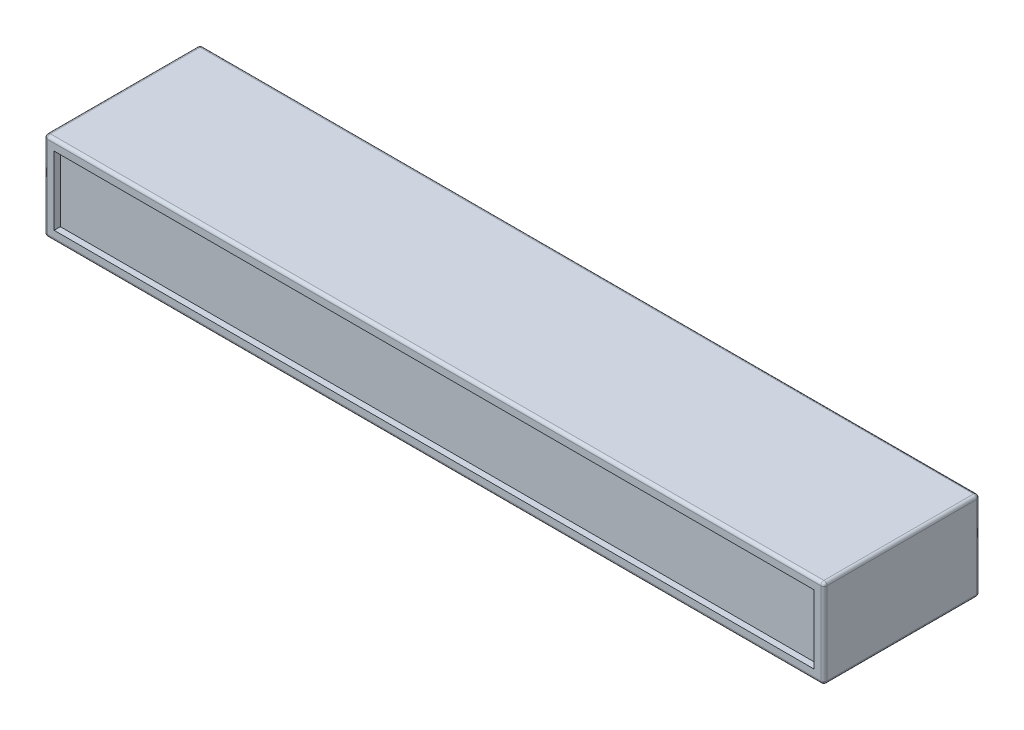
ISO-10303-21;
HEADER;
FILE_DESCRIPTION(('STEP AP214'),'2;1');
FILE_NAME('part.step','',(''),(''),'','','');
FILE_SCHEMA(('AUTOMOTIVE_DESIGN { 1 0 10303 214 1 1 1 1 }'));
ENDSEC;
DATA;
#1=APPLICATION_CONTEXT('core data for automotive mechanical design processes');
#2=APPLICATION_PROTOCOL_DEFINITION('international standard','automotive_design',2000,#1);
#3=PRODUCT_CONTEXT('',#1,'mechanical');
#4=PRODUCT('Part','Part','',(#3));
#5=PRODUCT_RELATED_PRODUCT_CATEGORY('part','',(#4));
#6=PRODUCT_DEFINITION_FORMATION('','',#4);
#7=PRODUCT_DEFINITION_CONTEXT('part definition',#1,'design');
#8=PRODUCT_DEFINITION('design','',#6,#7);
#9=PRODUCT_DEFINITION_SHAPE('','',#8);
#10=(LENGTH_UNIT() NAMED_UNIT(*) SI_UNIT(.MILLI.,.METRE.));
#11=(NAMED_UNIT(*) PLANE_ANGLE_UNIT() SI_UNIT($,.RADIAN.));
#12=(NAMED_UNIT(*) SI_UNIT($,.STERADIAN.) SOLID_ANGLE_UNIT());
#13=UNCERTAINTY_MEASURE_WITH_UNIT(LENGTH_MEASURE(1.E-05),#10,'distance_accuracy_value','');
#14=(GEOMETRIC_REPRESENTATION_CONTEXT(3) GLOBAL_UNCERTAINTY_ASSIGNED_CONTEXT((#13)) GLOBAL_UNIT_ASSIGNED_CONTEXT((#10,
#11,#12)) REPRESENTATION_CONTEXT('',''));
#15=CARTESIAN_POINT('',(0.,0.,0.));
#16=DIRECTION('',(0.,0.,1.));
#17=DIRECTION('',(1.,0.,0.));
#18=AXIS2_PLACEMENT_3D('',#15,#16,#17);
#19=CARTESIAN_POINT('',(0.,0.,500.));
#20=DIRECTION('',(1.,0.,0.));
#21=DIRECTION('',(0.,0.,-1.));
#22=AXIS2_PLACEMENT_3D('',#19,#20,#21);
#23=PLANE('',#22);
#24=DIRECTION('',(0.,0.,-1.));
#25=VECTOR('',#24,1.);
#26=CARTESIAN_POINT('',(0.,274.,500.));
#27=LINE('',#26,#25);
#28=CARTESIAN_POINT('',(0.,274.,490.));
#29=VERTEX_POINT('',#28);
#30=CARTESIAN_POINT('',(0.,274.,10.));
#31=VERTEX_POINT('',#30);
#32=EDGE_CURVE('E263',#29,#31,#27,.T.);
#33=ORIENTED_EDGE('',*,*,#32,.T.);
#34=DIRECTION('',(0.,-1.,0.));
#35=VECTOR('',#34,1.);
#36=CARTESIAN_POINT('',(0.,0.,10.));
#37=LINE('',#36,#35);
#38=CARTESIAN_POINT('',(0.,10.,10.));
#39=VERTEX_POINT('',#38);
#40=EDGE_CURVE('E267',#31,#39,#37,.T.);
#41=ORIENTED_EDGE('',*,*,#40,.T.);
#42=DIRECTION('',(0.,0.,-1.));
#43=VECTOR('',#42,1.);
#44=CARTESIAN_POINT('',(0.,10.,500.));
#45=LINE('',#44,#43);
#46=CARTESIAN_POINT('',(0.,10.,490.));
#47=VERTEX_POINT('',#46);
#48=EDGE_CURVE('E260',#39,#47,#45,.F.);
#49=ORIENTED_EDGE('',*,*,#48,.T.);
#50=DIRECTION('',(0.,-1.,0.));
#51=VECTOR('',#50,1.);
#52=CARTESIAN_POINT('',(0.,0.,490.));
#53=LINE('',#52,#51);
#54=EDGE_CURVE('E257',#47,#29,#53,.F.);
#55=ORIENTED_EDGE('',*,*,#54,.T.);
#56=EDGE_LOOP('',(#33,#41,#49,#55));
#57=FACE_BOUND('',#56,.T.);
#58=ADVANCED_FACE('F39',(#57),#23,.F.);
#59=CARTESIAN_POINT('',(0.,0.,500.));
#60=DIRECTION('',(0.,1.,0.));
#61=DIRECTION('',(0.,0.,1.));
#62=AXIS2_PLACEMENT_3D('',#59,#60,#61);
#63=PLANE('',#62);
#64=DIRECTION('',(1.,0.,0.));
#65=VECTOR('',#64,1.);
#66=CARTESIAN_POINT('',(2500.,0.,10.));
#67=LINE('',#66,#65);
#68=CARTESIAN_POINT('',(10.,0.,10.));
#69=VERTEX_POINT('',#68);
#70=CARTESIAN_POINT('',(2490.,0.,10.));
#71=VERTEX_POINT('',#70);
#72=EDGE_CURVE('E237',#69,#71,#67,.T.);
#73=ORIENTED_EDGE('',*,*,#72,.T.);
#74=DIRECTION('',(0.,0.,-1.));
#75=VECTOR('',#74,1.);
#76=CARTESIAN_POINT('',(2490.,0.,500.));
#77=LINE('',#76,#75);
#78=CARTESIAN_POINT('',(2490.,0.,490.));
#79=VERTEX_POINT('',#78);
#80=EDGE_CURVE('E240',#71,#79,#77,.F.);
#81=ORIENTED_EDGE('',*,*,#80,.T.);
#82=DIRECTION('',(1.,0.,0.));
#83=VECTOR('',#82,1.);
#84=CARTESIAN_POINT('',(0.,0.,490.));
#85=LINE('',#84,#83);
#86=CARTESIAN_POINT('',(10.,0.,490.));
#87=VERTEX_POINT('',#86);
#88=EDGE_CURVE('E231',#79,#87,#85,.F.);
#89=ORIENTED_EDGE('',*,*,#88,.T.);
#90=DIRECTION('',(0.,0.,-1.));
#91=VECTOR('',#90,1.);
#92=CARTESIAN_POINT('',(10.,0.,500.));
#93=LINE('',#92,#91);
#94=EDGE_CURVE('E234',#87,#69,#93,.T.);
#95=ORIENTED_EDGE('',*,*,#94,.T.);
#96=EDGE_LOOP('',(#73,#81,#89,#95));
#97=FACE_BOUND('',#96,.T.);
#98=ADVANCED_FACE('F384',(#97),#63,.F.);
#99=CARTESIAN_POINT('',(2500.,0.,500.));
#100=DIRECTION('',(-1.,0.,0.));
#101=DIRECTION('',(0.,0.,1.));
#102=AXIS2_PLACEMENT_3D('',#99,#100,#101);
#103=PLANE('',#102);
#104=DIRECTION('',(0.,0.,-1.));
#105=VECTOR('',#104,1.);
#106=CARTESIAN_POINT('',(2500.,10.,500.));
#107=LINE('',#106,#105);
#108=CARTESIAN_POINT('',(2500.,10.,490.));
#109=VERTEX_POINT('',#108);
#110=CARTESIAN_POINT('',(2500.,10.,10.));
#111=VERTEX_POINT('',#110);
#112=EDGE_CURVE('E211',#109,#111,#107,.T.);
#113=ORIENTED_EDGE('',*,*,#112,.T.);
#114=DIRECTION('',(0.,1.,0.));
#115=VECTOR('',#114,1.);
#116=CARTESIAN_POINT('',(2500.,284.,10.));
#117=LINE('',#116,#115);
#118=CARTESIAN_POINT('',(2500.,274.,10.));
#119=VERTEX_POINT('',#118);
#120=EDGE_CURVE('E214',#111,#119,#117,.T.);
#121=ORIENTED_EDGE('',*,*,#120,.T.);
#122=DIRECTION('',(0.,0.,-1.));
#123=VECTOR('',#122,1.);
#124=CARTESIAN_POINT('',(2500.,274.,500.));
#125=LINE('',#124,#123);
#126=CARTESIAN_POINT('',(2500.,274.,490.));
#127=VERTEX_POINT('',#126);
#128=EDGE_CURVE('E208',#119,#127,#125,.F.);
#129=ORIENTED_EDGE('',*,*,#128,.T.);
#130=DIRECTION('',(0.,1.,0.));
#131=VECTOR('',#130,1.);
#132=CARTESIAN_POINT('',(2500.,0.,490.));
#133=LINE('',#132,#131);
#134=EDGE_CURVE('E205',#127,#109,#133,.F.);
#135=ORIENTED_EDGE('',*,*,#134,.T.);
#136=EDGE_LOOP('',(#113,#121,#129,#135));
#137=FACE_BOUND('',#136,.T.);
#138=ADVANCED_FACE('F427',(#137),#103,.F.);
#139=CARTESIAN_POINT('',(0.,284.,500.));
#140=DIRECTION('',(0.,-1.,0.));
#141=DIRECTION('',(0.,0.,-1.));
#142=AXIS2_PLACEMENT_3D('',#139,#140,#141);
#143=PLANE('',#142);
#144=DIRECTION('',(-1.,0.,0.));
#145=VECTOR('',#144,1.);
#146=CARTESIAN_POINT('',(0.,284.,490.));
#147=LINE('',#146,#145);
#148=CARTESIAN_POINT('',(10.,284.,490.));
#149=VERTEX_POINT('',#148);
#150=CARTESIAN_POINT('',(2490.,284.,490.));
#151=VERTEX_POINT('',#150);
#152=EDGE_CURVE('E244',#149,#151,#147,.F.);
#153=ORIENTED_EDGE('',*,*,#152,.T.);
#154=DIRECTION('',(0.,0.,-1.));
#155=VECTOR('',#154,1.);
#156=CARTESIAN_POINT('',(2490.,284.,500.));
#157=LINE('',#156,#155);
#158=CARTESIAN_POINT('',(2490.,284.,10.));
#159=VERTEX_POINT('',#158);
#160=EDGE_CURVE('E253',#151,#159,#157,.T.);
#161=ORIENTED_EDGE('',*,*,#160,.T.);
#162=DIRECTION('',(-1.,0.,0.));
#163=VECTOR('',#162,1.);
#164=CARTESIAN_POINT('',(0.,284.,10.));
#165=LINE('',#164,#163);
#166=CARTESIAN_POINT('',(10.,284.,10.));
#167=VERTEX_POINT('',#166);
#168=EDGE_CURVE('E250',#159,#167,#165,.T.);
#169=ORIENTED_EDGE('',*,*,#168,.T.);
#170=DIRECTION('',(0.,0.,-1.));
#171=VECTOR('',#170,1.);
#172=CARTESIAN_POINT('',(10.,284.,500.));
#173=LINE('',#172,#171);
#174=EDGE_CURVE('E247',#167,#149,#173,.F.);
#175=ORIENTED_EDGE('',*,*,#174,.T.);
#176=EDGE_LOOP('',(#153,#161,#169,#175));
#177=FACE_BOUND('',#176,.T.);
#178=ADVANCED_FACE('F662',(#177),#143,.F.);
#179=CARTESIAN_POINT('',(0.,0.,500.));
#180=DIRECTION('',(0.,0.,-1.));
#181=DIRECTION('',(-1.,0.,0.));
#182=AXIS2_PLACEMENT_3D('',#179,#180,#181);
#183=PLANE('',#182);
#184=DIRECTION('',(-1.,0.,0.));
#185=VECTOR('',#184,1.);
#186=CARTESIAN_POINT('',(2468.,252.,500.));
#187=LINE('',#186,#185);
#188=CARTESIAN_POINT('',(2468.,252.,500.));
#189=VERTEX_POINT('',#188);
#190=CARTESIAN_POINT('',(32.,252.,500.));
#191=VERTEX_POINT('',#190);
#192=EDGE_CURVE('E190',#189,#191,#187,.T.);
#193=ORIENTED_EDGE('',*,*,#192,.F.);
#194=DIRECTION('',(0.,1.,0.));
#195=VECTOR('',#194,1.);
#196=CARTESIAN_POINT('',(2468.,252.,500.));
#197=LINE('',#196,#195);
#198=CARTESIAN_POINT('',(2468.,32.,500.));
#199=VERTEX_POINT('',#198);
#200=EDGE_CURVE('E57',#199,#189,#197,.T.);
#201=ORIENTED_EDGE('',*,*,#200,.F.);
#202=DIRECTION('',(1.,0.,0.));
#203=VECTOR('',#202,1.);
#204=CARTESIAN_POINT('',(2468.,32.,500.));
#205=LINE('',#204,#203);
#206=CARTESIAN_POINT('',(32.,31.9999999999997,500.));
#207=VERTEX_POINT('',#206);
#208=EDGE_CURVE('E177',#207,#199,#205,.T.);
#209=ORIENTED_EDGE('',*,*,#208,.F.);
#210=DIRECTION('',(0.,-1.,0.));
#211=VECTOR('',#210,1.);
#212=CARTESIAN_POINT('',(32.,252.,500.));
#213=LINE('',#212,#211);
#214=EDGE_CURVE('E181',#191,#207,#213,.T.);
#215=ORIENTED_EDGE('',*,*,#214,.F.);
#216=EDGE_LOOP('',(#193,#201,#209,#215));
#217=FACE_BOUND('',#216,.T.);
#218=DIRECTION('',(0.,1.,0.));
#219=VECTOR('',#218,1.);
#220=CARTESIAN_POINT('',(2490.,0.,500.));
#221=LINE('',#220,#219);
#222=CARTESIAN_POINT('',(2490.,10.,500.));
#223=VERTEX_POINT('',#222);
#224=CARTESIAN_POINT('',(2490.,274.,500.));
#225=VERTEX_POINT('',#224);
#226=EDGE_CURVE('E49',#223,#225,#221,.T.);
#227=ORIENTED_EDGE('',*,*,#226,.T.);
#228=DIRECTION('',(-1.,0.,0.));
#229=VECTOR('',#228,1.);
#230=CARTESIAN_POINT('',(0.,274.,500.));
#231=LINE('',#230,#229);
#232=CARTESIAN_POINT('',(10.,274.,500.));
#233=VERTEX_POINT('',#232);
#234=EDGE_CURVE('E11',#225,#233,#231,.T.);
#235=ORIENTED_EDGE('',*,*,#234,.T.);
#236=DIRECTION('',(0.,-1.,0.));
#237=VECTOR('',#236,1.);
#238=CARTESIAN_POINT('',(10.,0.,500.));
#239=LINE('',#238,#237);
#240=CARTESIAN_POINT('',(10.,10.,500.));
#241=VERTEX_POINT('',#240);
#242=EDGE_CURVE('E270',#233,#241,#239,.T.);
#243=ORIENTED_EDGE('',*,*,#242,.T.);
#244=DIRECTION('',(1.,0.,0.));
#245=VECTOR('',#244,1.);
#246=CARTESIAN_POINT('',(0.,10.,500.));
#247=LINE('',#246,#245);
#248=EDGE_CURVE('E273',#241,#223,#247,.T.);
#249=ORIENTED_EDGE('',*,*,#248,.T.);
#250=EDGE_LOOP('',(#227,#235,#243,#249));
#251=FACE_BOUND('',#250,.T.);
#252=ADVANCED_FACE('F391',(#217,#251),#183,.F.);
#253=CARTESIAN_POINT('',(0.,0.,0.));
#254=DIRECTION('',(0.,0.,-1.));
#255=DIRECTION('',(-1.,0.,0.));
#256=AXIS2_PLACEMENT_3D('',#253,#254,#255);
#257=PLANE('',#256);
#258=DIRECTION('',(-1.,0.,0.));
#259=VECTOR('',#258,1.);
#260=CARTESIAN_POINT('',(2500.,274.,0.));
#261=LINE('',#260,#259);
#262=CARTESIAN_POINT('',(10.,274.,0.));
#263=VERTEX_POINT('',#262);
#264=CARTESIAN_POINT('',(2490.,274.,0.));
#265=VERTEX_POINT('',#264);
#266=EDGE_CURVE('E221',#263,#265,#261,.F.);
#267=ORIENTED_EDGE('',*,*,#266,.T.);
#268=DIRECTION('',(0.,1.,0.));
#269=VECTOR('',#268,1.);
#270=CARTESIAN_POINT('',(2490.,0.,0.));
#271=LINE('',#270,#269);
#272=CARTESIAN_POINT('',(2490.,10.,0.));
#273=VERTEX_POINT('',#272);
#274=EDGE_CURVE('E227',#265,#273,#271,.F.);
#275=ORIENTED_EDGE('',*,*,#274,.T.);
#276=DIRECTION('',(1.,0.,0.));
#277=VECTOR('',#276,1.);
#278=CARTESIAN_POINT('',(0.,10.,0.));
#279=LINE('',#278,#277);
#280=CARTESIAN_POINT('',(10.,10.,0.));
#281=VERTEX_POINT('',#280);
#282=EDGE_CURVE('E224',#273,#281,#279,.F.);
#283=ORIENTED_EDGE('',*,*,#282,.T.);
#284=DIRECTION('',(0.,-1.,0.));
#285=VECTOR('',#284,1.);
#286=CARTESIAN_POINT('',(10.,284.,0.));
#287=LINE('',#286,#285);
#288=EDGE_CURVE('E218',#281,#263,#287,.F.);
#289=ORIENTED_EDGE('',*,*,#288,.T.);
#290=EDGE_LOOP('',(#267,#275,#283,#289));
#291=FACE_BOUND('',#290,.T.);
#292=ADVANCED_FACE('F415',(#291),#257,.T.);
#293=CARTESIAN_POINT('',(10.,0.,490.));
#294=DIRECTION('',(0.,-1.,0.));
#295=DIRECTION('',(0.,0.,-1.));
#296=AXIS2_PLACEMENT_3D('',#293,#294,#295);
#297=CYLINDRICAL_SURFACE('',#296,10.);
#298=CARTESIAN_POINT('',(10.,10.,490.));
#299=DIRECTION('',(0.,-1.,0.));
#300=DIRECTION('',(0.,0.,-1.));
#301=AXIS2_PLACEMENT_3D('',#298,#299,#300);
#302=CIRCLE('',#301,10.);
#303=EDGE_CURVE('E43',#241,#47,#302,.T.);
#304=ORIENTED_EDGE('',*,*,#303,.F.);
#305=ORIENTED_EDGE('',*,*,#242,.F.);
#306=CARTESIAN_POINT('',(10.,274.,490.));
#307=DIRECTION('',(0.,1.,0.));
#308=DIRECTION('',(0.,0.,1.));
#309=AXIS2_PLACEMENT_3D('',#306,#307,#308);
#310=CIRCLE('',#309,10.);
#311=EDGE_CURVE('E358',#29,#233,#310,.T.);
#312=ORIENTED_EDGE('',*,*,#311,.F.);
#313=ORIENTED_EDGE('',*,*,#54,.F.);
#314=EDGE_LOOP('',(#304,#305,#312,#313));
#315=FACE_BOUND('',#314,.T.);
#316=ADVANCED_FACE('F41',(#315),#297,.T.);
#317=CARTESIAN_POINT('',(10.,10.,490.));
#318=DIRECTION('',(0.,0.,1.));
#319=DIRECTION('',(1.,0.,0.));
#320=AXIS2_PLACEMENT_3D('',#317,#318,#319);
#321=SPHERICAL_SURFACE('',#320,10.);
#322=CARTESIAN_POINT('',(10.,10.,490.));
#323=DIRECTION('',(-1.,0.,0.));
#324=DIRECTION('',(0.,0.,1.));
#325=AXIS2_PLACEMENT_3D('',#322,#323,#324);
#326=CIRCLE('',#325,10.);
#327=EDGE_CURVE('E351',#241,#87,#326,.F.);
#328=ORIENTED_EDGE('',*,*,#327,.F.);
#329=ORIENTED_EDGE('',*,*,#303,.T.);
#330=CARTESIAN_POINT('',(10.,10.,490.));
#331=DIRECTION('',(0.,0.,1.));
#332=DIRECTION('',(1.,0.,0.));
#333=AXIS2_PLACEMENT_3D('',#330,#331,#332);
#334=CIRCLE('',#333,10.);
#335=EDGE_CURVE('E355',#87,#47,#334,.F.);
#336=ORIENTED_EDGE('',*,*,#335,.F.);
#337=EDGE_LOOP('',(#328,#329,#336));
#338=FACE_BOUND('',#337,.T.);
#339=ADVANCED_FACE('F372',(#338),#321,.T.);
#340=CARTESIAN_POINT('',(10.,274.,490.));
#341=DIRECTION('',(0.,0.,1.));
#342=DIRECTION('',(1.,0.,0.));
#343=AXIS2_PLACEMENT_3D('',#340,#341,#342);
#344=SPHERICAL_SURFACE('',#343,10.);
#345=CARTESIAN_POINT('',(10.,274.,490.));
#346=DIRECTION('',(0.,0.,1.));
#347=DIRECTION('',(1.,0.,0.));
#348=AXIS2_PLACEMENT_3D('',#345,#346,#347);
#349=CIRCLE('',#348,10.);
#350=EDGE_CURVE('E344',#29,#149,#349,.F.);
#351=ORIENTED_EDGE('',*,*,#350,.F.);
#352=ORIENTED_EDGE('',*,*,#311,.T.);
#353=CARTESIAN_POINT('',(10.,274.,490.));
#354=DIRECTION('',(-1.,0.,0.));
#355=DIRECTION('',(0.,0.,1.));
#356=AXIS2_PLACEMENT_3D('',#353,#354,#355);
#357=CIRCLE('',#356,10.);
#358=EDGE_CURVE('E348',#149,#233,#357,.F.);
#359=ORIENTED_EDGE('',*,*,#358,.F.);
#360=EDGE_LOOP('',(#351,#352,#359));
#361=FACE_BOUND('',#360,.T.);
#362=ADVANCED_FACE('F406',(#361),#344,.T.);
#363=CARTESIAN_POINT('',(10.,10.,500.));
#364=DIRECTION('',(0.,0.,-1.));
#365=DIRECTION('',(-1.,0.,0.));
#366=AXIS2_PLACEMENT_3D('',#363,#364,#365);
#367=CYLINDRICAL_SURFACE('',#366,10.);
#368=ORIENTED_EDGE('',*,*,#335,.T.);
#369=ORIENTED_EDGE('',*,*,#48,.F.);
#370=CARTESIAN_POINT('',(10.,10.,10.));
#371=DIRECTION('',(0.,0.,-1.));
#372=DIRECTION('',(-1.,0.,0.));
#373=AXIS2_PLACEMENT_3D('',#370,#371,#372);
#374=CIRCLE('',#373,10.);
#375=EDGE_CURVE('E336',#69,#39,#374,.T.);
#376=ORIENTED_EDGE('',*,*,#375,.F.);
#377=ORIENTED_EDGE('',*,*,#94,.F.);
#378=EDGE_LOOP('',(#368,#369,#376,#377));
#379=FACE_BOUND('',#378,.T.);
#380=ADVANCED_FACE('F379',(#379),#367,.T.);
#381=CARTESIAN_POINT('',(0.,10.,490.));
#382=DIRECTION('',(1.,0.,0.));
#383=DIRECTION('',(0.,0.,-1.));
#384=AXIS2_PLACEMENT_3D('',#381,#382,#383);
#385=CYLINDRICAL_SURFACE('',#384,10.);
#386=ORIENTED_EDGE('',*,*,#327,.T.);
#387=ORIENTED_EDGE('',*,*,#88,.F.);
#388=CARTESIAN_POINT('',(2490.,10.,490.));
#389=DIRECTION('',(1.,0.,0.));
#390=DIRECTION('',(0.,0.,-1.));
#391=AXIS2_PLACEMENT_3D('',#388,#389,#390);
#392=CIRCLE('',#391,10.);
#393=EDGE_CURVE('E332',#223,#79,#392,.T.);
#394=ORIENTED_EDGE('',*,*,#393,.F.);
#395=ORIENTED_EDGE('',*,*,#248,.F.);
#396=EDGE_LOOP('',(#386,#387,#394,#395));
#397=FACE_BOUND('',#396,.T.);
#398=ADVANCED_FACE('F390',(#397),#385,.T.);
#399=CARTESIAN_POINT('',(2490.,0.,490.));
#400=DIRECTION('',(0.,1.,0.));
#401=DIRECTION('',(0.,0.,1.));
#402=AXIS2_PLACEMENT_3D('',#399,#400,#401);
#403=CYLINDRICAL_SURFACE('',#402,10.);
#404=CARTESIAN_POINT('',(2490.,274.,490.));
#405=DIRECTION('',(0.,1.,0.));
#406=DIRECTION('',(0.,0.,1.));
#407=AXIS2_PLACEMENT_3D('',#404,#405,#406);
#408=CIRCLE('',#407,10.);
#409=EDGE_CURVE('E324',#225,#127,#408,.T.);
#410=ORIENTED_EDGE('',*,*,#409,.F.);
#411=ORIENTED_EDGE('',*,*,#226,.F.);
#412=CARTESIAN_POINT('',(2490.,10.,490.));
#413=DIRECTION('',(0.,-1.,0.));
#414=DIRECTION('',(0.,0.,-1.));
#415=AXIS2_PLACEMENT_3D('',#412,#413,#414);
#416=CIRCLE('',#415,10.);
#417=EDGE_CURVE('E328',#109,#223,#416,.T.);
#418=ORIENTED_EDGE('',*,*,#417,.F.);
#419=ORIENTED_EDGE('',*,*,#134,.F.);
#420=EDGE_LOOP('',(#410,#411,#418,#419));
#421=FACE_BOUND('',#420,.T.);
#422=ADVANCED_FACE('F395',(#421),#403,.T.);
#423=CARTESIAN_POINT('',(0.,274.,490.));
#424=DIRECTION('',(-1.,0.,0.));
#425=DIRECTION('',(0.,0.,1.));
#426=AXIS2_PLACEMENT_3D('',#423,#424,#425);
#427=CYLINDRICAL_SURFACE('',#426,10.);
#428=ORIENTED_EDGE('',*,*,#358,.T.);
#429=ORIENTED_EDGE('',*,*,#234,.F.);
#430=CARTESIAN_POINT('',(2490.,274.,490.));
#431=DIRECTION('',(1.,0.,0.));
#432=DIRECTION('',(0.,0.,-1.));
#433=AXIS2_PLACEMENT_3D('',#430,#431,#432);
#434=CIRCLE('',#433,10.);
#435=EDGE_CURVE('E320',#151,#225,#434,.T.);
#436=ORIENTED_EDGE('',*,*,#435,.F.);
#437=ORIENTED_EDGE('',*,*,#152,.F.);
#438=EDGE_LOOP('',(#428,#429,#436,#437));
#439=FACE_BOUND('',#438,.T.);
#440=ADVANCED_FACE('F405',(#439),#427,.T.);
#441=CARTESIAN_POINT('',(10.,274.,500.));
#442=DIRECTION('',(0.,0.,-1.));
#443=DIRECTION('',(-1.,0.,0.));
#444=AXIS2_PLACEMENT_3D('',#441,#442,#443);
#445=CYLINDRICAL_SURFACE('',#444,10.);
#446=ORIENTED_EDGE('',*,*,#350,.T.);
#447=ORIENTED_EDGE('',*,*,#174,.F.);
#448=CARTESIAN_POINT('',(10.,274.,10.));
#449=DIRECTION('',(0.,0.,-1.));
#450=DIRECTION('',(-1.,0.,0.));
#451=AXIS2_PLACEMENT_3D('',#448,#449,#450);
#452=CIRCLE('',#451,10.);
#453=EDGE_CURVE('E316',#31,#167,#452,.T.);
#454=ORIENTED_EDGE('',*,*,#453,.F.);
#455=ORIENTED_EDGE('',*,*,#32,.F.);
#456=EDGE_LOOP('',(#446,#447,#454,#455));
#457=FACE_BOUND('',#456,.T.);
#458=ADVANCED_FACE('F411',(#457),#445,.T.);
#459=CARTESIAN_POINT('',(10.,0.,10.));
#460=DIRECTION('',(0.,1.,0.));
#461=DIRECTION('',(0.,0.,1.));
#462=AXIS2_PLACEMENT_3D('',#459,#460,#461);
#463=CYLINDRICAL_SURFACE('',#462,10.);
#464=CARTESIAN_POINT('',(10.,10.,10.));
#465=DIRECTION('',(0.,-1.,0.));
#466=DIRECTION('',(0.,0.,-1.));
#467=AXIS2_PLACEMENT_3D('',#464,#465,#466);
#468=CIRCLE('',#467,10.);
#469=EDGE_CURVE('E340',#39,#281,#468,.T.);
#470=ORIENTED_EDGE('',*,*,#469,.F.);
#471=ORIENTED_EDGE('',*,*,#40,.F.);
#472=CARTESIAN_POINT('',(10.,274.,10.));
#473=DIRECTION('',(0.,1.,0.));
#474=DIRECTION('',(0.,0.,1.));
#475=AXIS2_PLACEMENT_3D('',#472,#473,#474);
#476=CIRCLE('',#475,10.);
#477=EDGE_CURVE('E313',#263,#31,#476,.T.);
#478=ORIENTED_EDGE('',*,*,#477,.F.);
#479=ORIENTED_EDGE('',*,*,#288,.F.);
#480=EDGE_LOOP('',(#470,#471,#478,#479));
#481=FACE_BOUND('',#480,.T.);
#482=ADVANCED_FACE('F472',(#481),#463,.T.);
#483=CARTESIAN_POINT('',(10.,10.,10.));
#484=DIRECTION('',(0.,0.,1.));
#485=DIRECTION('',(1.,0.,0.));
#486=AXIS2_PLACEMENT_3D('',#483,#484,#485);
#487=SPHERICAL_SURFACE('',#486,10.);
#488=ORIENTED_EDGE('',*,*,#375,.T.);
#489=ORIENTED_EDGE('',*,*,#469,.T.);
#490=CARTESIAN_POINT('',(10.,10.,10.));
#491=DIRECTION('',(-1.,0.,0.));
#492=DIRECTION('',(0.,0.,1.));
#493=AXIS2_PLACEMENT_3D('',#490,#491,#492);
#494=CIRCLE('',#493,10.);
#495=EDGE_CURVE('E309',#69,#281,#494,.F.);
#496=ORIENTED_EDGE('',*,*,#495,.F.);
#497=EDGE_LOOP('',(#488,#489,#496));
#498=FACE_BOUND('',#497,.T.);
#499=ADVANCED_FACE('F468',(#498),#487,.T.);
#500=CARTESIAN_POINT('',(2490.,10.,490.));
#501=DIRECTION('',(0.,0.,1.));
#502=DIRECTION('',(1.,0.,0.));
#503=AXIS2_PLACEMENT_3D('',#500,#501,#502);
#504=SPHERICAL_SURFACE('',#503,10.);
#505=ORIENTED_EDGE('',*,*,#417,.T.);
#506=ORIENTED_EDGE('',*,*,#393,.T.);
#507=CARTESIAN_POINT('',(2490.,10.,490.));
#508=DIRECTION('',(0.,0.,1.));
#509=DIRECTION('',(1.,0.,0.));
#510=AXIS2_PLACEMENT_3D('',#507,#508,#509);
#511=CIRCLE('',#510,10.);
#512=EDGE_CURVE('E306',#109,#79,#511,.F.);
#513=ORIENTED_EDGE('',*,*,#512,.F.);
#514=EDGE_LOOP('',(#505,#506,#513));
#515=FACE_BOUND('',#514,.T.);
#516=ADVANCED_FACE('F465',(#515),#504,.T.);
#517=CARTESIAN_POINT('',(2490.,274.,490.));
#518=DIRECTION('',(0.,0.,1.));
#519=DIRECTION('',(1.,0.,0.));
#520=AXIS2_PLACEMENT_3D('',#517,#518,#519);
#521=SPHERICAL_SURFACE('',#520,10.);
#522=ORIENTED_EDGE('',*,*,#435,.T.);
#523=ORIENTED_EDGE('',*,*,#409,.T.);
#524=CARTESIAN_POINT('',(2490.,274.,490.));
#525=DIRECTION('',(0.,0.,1.));
#526=DIRECTION('',(1.,0.,0.));
#527=AXIS2_PLACEMENT_3D('',#524,#525,#526);
#528=CIRCLE('',#527,10.);
#529=EDGE_CURVE('E302',#151,#127,#528,.F.);
#530=ORIENTED_EDGE('',*,*,#529,.F.);
#531=EDGE_LOOP('',(#522,#523,#530));
#532=FACE_BOUND('',#531,.T.);
#533=ADVANCED_FACE('F401',(#532),#521,.T.);
#534=CARTESIAN_POINT('',(10.,274.,10.));
#535=DIRECTION('',(0.,0.,1.));
#536=DIRECTION('',(1.,0.,0.));
#537=AXIS2_PLACEMENT_3D('',#534,#535,#536);
#538=SPHERICAL_SURFACE('',#537,10.);
#539=ORIENTED_EDGE('',*,*,#477,.T.);
#540=ORIENTED_EDGE('',*,*,#453,.T.);
#541=CARTESIAN_POINT('',(10.,274.,10.));
#542=DIRECTION('',(-1.,0.,0.));
#543=DIRECTION('',(0.,0.,1.));
#544=AXIS2_PLACEMENT_3D('',#541,#542,#543);
#545=CIRCLE('',#544,10.);
#546=EDGE_CURVE('E298',#263,#167,#545,.F.);
#547=ORIENTED_EDGE('',*,*,#546,.F.);
#548=EDGE_LOOP('',(#539,#540,#547));
#549=FACE_BOUND('',#548,.T.);
#550=ADVANCED_FACE('F458',(#549),#538,.T.);
#551=CARTESIAN_POINT('',(0.,10.,10.));
#552=DIRECTION('',(-1.,0.,0.));
#553=DIRECTION('',(0.,0.,1.));
#554=AXIS2_PLACEMENT_3D('',#551,#552,#553);
#555=CYLINDRICAL_SURFACE('',#554,10.);
#556=ORIENTED_EDGE('',*,*,#495,.T.);
#557=ORIENTED_EDGE('',*,*,#282,.F.);
#558=CARTESIAN_POINT('',(2490.,10.,10.));
#559=DIRECTION('',(1.,0.,0.));
#560=DIRECTION('',(0.,0.,-1.));
#561=AXIS2_PLACEMENT_3D('',#558,#559,#560);
#562=CIRCLE('',#561,10.);
#563=EDGE_CURVE('E294',#71,#273,#562,.T.);
#564=ORIENTED_EDGE('',*,*,#563,.F.);
#565=ORIENTED_EDGE('',*,*,#72,.F.);
#566=EDGE_LOOP('',(#556,#557,#564,#565));
#567=FACE_BOUND('',#566,.T.);
#568=ADVANCED_FACE('F454',(#567),#555,.T.);
#569=CARTESIAN_POINT('',(2490.,10.,500.));
#570=DIRECTION('',(0.,0.,-1.));
#571=DIRECTION('',(-1.,0.,0.));
#572=AXIS2_PLACEMENT_3D('',#569,#570,#571);
#573=CYLINDRICAL_SURFACE('',#572,10.);
#574=ORIENTED_EDGE('',*,*,#512,.T.);
#575=ORIENTED_EDGE('',*,*,#80,.F.);
#576=CARTESIAN_POINT('',(2490.,10.,10.));
#577=DIRECTION('',(0.,0.,-1.));
#578=DIRECTION('',(-1.,0.,0.));
#579=AXIS2_PLACEMENT_3D('',#576,#577,#578);
#580=CIRCLE('',#579,10.);
#581=EDGE_CURVE('E290',#111,#71,#580,.T.);
#582=ORIENTED_EDGE('',*,*,#581,.F.);
#583=ORIENTED_EDGE('',*,*,#112,.F.);
#584=EDGE_LOOP('',(#574,#575,#582,#583));
#585=FACE_BOUND('',#584,.T.);
#586=ADVANCED_FACE('F450',(#585),#573,.T.);
#587=CARTESIAN_POINT('',(2490.,274.,500.));
#588=DIRECTION('',(0.,0.,-1.));
#589=DIRECTION('',(-1.,0.,0.));
#590=AXIS2_PLACEMENT_3D('',#587,#588,#589);
#591=CYLINDRICAL_SURFACE('',#590,10.);
#592=ORIENTED_EDGE('',*,*,#529,.T.);
#593=ORIENTED_EDGE('',*,*,#128,.F.);
#594=CARTESIAN_POINT('',(2490.,274.,10.));
#595=DIRECTION('',(0.,0.,-1.));
#596=DIRECTION('',(-1.,0.,0.));
#597=AXIS2_PLACEMENT_3D('',#594,#595,#596);
#598=CIRCLE('',#597,10.);
#599=EDGE_CURVE('E286',#159,#119,#598,.T.);
#600=ORIENTED_EDGE('',*,*,#599,.F.);
#601=ORIENTED_EDGE('',*,*,#160,.F.);
#602=EDGE_LOOP('',(#592,#593,#600,#601));
#603=FACE_BOUND('',#602,.T.);
#604=ADVANCED_FACE('F446',(#603),#591,.T.);
#605=CARTESIAN_POINT('',(0.,274.,10.));
#606=DIRECTION('',(1.,0.,0.));
#607=DIRECTION('',(0.,0.,-1.));
#608=AXIS2_PLACEMENT_3D('',#605,#606,#607);
#609=CYLINDRICAL_SURFACE('',#608,10.);
#610=ORIENTED_EDGE('',*,*,#546,.T.);
#611=ORIENTED_EDGE('',*,*,#168,.F.);
#612=CARTESIAN_POINT('',(2490.,274.,10.));
#613=DIRECTION('',(1.,0.,0.));
#614=DIRECTION('',(0.,0.,-1.));
#615=AXIS2_PLACEMENT_3D('',#612,#613,#614);
#616=CIRCLE('',#615,10.);
#617=EDGE_CURVE('E283',#265,#159,#616,.T.);
#618=ORIENTED_EDGE('',*,*,#617,.F.);
#619=ORIENTED_EDGE('',*,*,#266,.F.);
#620=EDGE_LOOP('',(#610,#611,#618,#619));
#621=FACE_BOUND('',#620,.T.);
#622=ADVANCED_FACE('F442',(#621),#609,.T.);
#623=CARTESIAN_POINT('',(2490.,10.,10.));
#624=DIRECTION('',(0.,0.,1.));
#625=DIRECTION('',(1.,0.,0.));
#626=AXIS2_PLACEMENT_3D('',#623,#624,#625);
#627=SPHERICAL_SURFACE('',#626,10.);
#628=ORIENTED_EDGE('',*,*,#581,.T.);
#629=ORIENTED_EDGE('',*,*,#563,.T.);
#630=CARTESIAN_POINT('',(2490.,10.,10.));
#631=DIRECTION('',(0.,-1.,0.));
#632=DIRECTION('',(0.,0.,-1.));
#633=AXIS2_PLACEMENT_3D('',#630,#631,#632);
#634=CIRCLE('',#633,10.);
#635=EDGE_CURVE('E280',#111,#273,#634,.F.);
#636=ORIENTED_EDGE('',*,*,#635,.F.);
#637=EDGE_LOOP('',(#628,#629,#636));
#638=FACE_BOUND('',#637,.T.);
#639=ADVANCED_FACE('F438',(#638),#627,.T.);
#640=CARTESIAN_POINT('',(2490.,274.,10.));
#641=DIRECTION('',(0.,0.,1.));
#642=DIRECTION('',(1.,0.,0.));
#643=AXIS2_PLACEMENT_3D('',#640,#641,#642);
#644=SPHERICAL_SURFACE('',#643,10.);
#645=ORIENTED_EDGE('',*,*,#617,.T.);
#646=ORIENTED_EDGE('',*,*,#599,.T.);
#647=CARTESIAN_POINT('',(2490.,274.,10.));
#648=DIRECTION('',(0.,1.,0.));
#649=DIRECTION('',(0.,0.,1.));
#650=AXIS2_PLACEMENT_3D('',#647,#648,#649);
#651=CIRCLE('',#650,10.);
#652=EDGE_CURVE('E199',#265,#119,#651,.F.);
#653=ORIENTED_EDGE('',*,*,#652,.F.);
#654=EDGE_LOOP('',(#645,#646,#653));
#655=FACE_BOUND('',#654,.T.);
#656=ADVANCED_FACE('F434',(#655),#644,.T.);
#657=CARTESIAN_POINT('',(2490.,0.,10.));
#658=DIRECTION('',(0.,-1.,0.));
#659=DIRECTION('',(0.,0.,-1.));
#660=AXIS2_PLACEMENT_3D('',#657,#658,#659);
#661=CYLINDRICAL_SURFACE('',#660,10.);
#662=ORIENTED_EDGE('',*,*,#635,.T.);
#663=ORIENTED_EDGE('',*,*,#274,.F.);
#664=ORIENTED_EDGE('',*,*,#652,.T.);
#665=ORIENTED_EDGE('',*,*,#120,.F.);
#666=EDGE_LOOP('',(#662,#663,#664,#665));
#667=FACE_BOUND('',#666,.T.);
#668=ADVANCED_FACE('F431',(#667),#661,.T.);
#669=CARTESIAN_POINT('',(2468.,252.,480.));
#670=DIRECTION('',(1.,0.,0.));
#671=DIRECTION('',(0.,0.,-1.));
#672=AXIS2_PLACEMENT_3D('',#669,#670,#671);
#673=PLANE('',#672);
#674=ORIENTED_EDGE('',*,*,#200,.T.);
#675=DIRECTION('',(0.,0.,1.));
#676=VECTOR('',#675,1.);
#677=CARTESIAN_POINT('',(2468.,252.,480.));
#678=LINE('',#677,#676);
#679=CARTESIAN_POINT('',(2468.,252.,480.));
#680=VERTEX_POINT('',#679);
#681=EDGE_CURVE('E152',#680,#189,#678,.T.);
#682=ORIENTED_EDGE('',*,*,#681,.F.);
#683=DIRECTION('',(0.,1.,0.));
#684=VECTOR('',#683,1.);
#685=CARTESIAN_POINT('',(2468.,252.,480.));
#686=LINE('',#685,#684);
#687=CARTESIAN_POINT('',(2468.,32.,480.));
#688=VERTEX_POINT('',#687);
#689=EDGE_CURVE('E156',#688,#680,#686,.T.);
#690=ORIENTED_EDGE('',*,*,#689,.F.);
#691=DIRECTION('',(0.,0.,1.));
#692=VECTOR('',#691,1.);
#693=CARTESIAN_POINT('',(2468.,32.,480.));
#694=LINE('',#693,#692);
#695=EDGE_CURVE('E196',#688,#199,#694,.T.);
#696=ORIENTED_EDGE('',*,*,#695,.T.);
#697=EDGE_LOOP('',(#674,#682,#690,#696));
#698=FACE_BOUND('',#697,.T.);
#699=ADVANCED_FACE('F154',(#698),#673,.F.);
#700=CARTESIAN_POINT('',(2468.,32.,480.));
#701=DIRECTION('',(0.,-1.,0.));
#702=DIRECTION('',(1.,0.,0.));
#703=AXIS2_PLACEMENT_3D('',#700,#701,#702);
#704=PLANE('',#703);
#705=ORIENTED_EDGE('',*,*,#208,.T.);
#706=ORIENTED_EDGE('',*,*,#695,.F.);
#707=DIRECTION('',(1.,0.,0.));
#708=VECTOR('',#707,1.);
#709=CARTESIAN_POINT('',(2468.,32.,480.));
#710=LINE('',#709,#708);
#711=CARTESIAN_POINT('',(32.,31.9999999999997,480.));
#712=VERTEX_POINT('',#711);
#713=EDGE_CURVE('E163',#712,#688,#710,.T.);
#714=ORIENTED_EDGE('',*,*,#713,.F.);
#715=DIRECTION('',(0.,0.,1.));
#716=VECTOR('',#715,1.);
#717=CARTESIAN_POINT('',(32.,31.9999999999997,480.));
#718=LINE('',#717,#716);
#719=EDGE_CURVE('E200',#712,#207,#718,.T.);
#720=ORIENTED_EDGE('',*,*,#719,.T.);
#721=EDGE_LOOP('',(#705,#706,#714,#720));
#722=FACE_BOUND('',#721,.T.);
#723=ADVANCED_FACE('F567',(#722),#704,.F.);
#724=CARTESIAN_POINT('',(32.,252.,480.));
#725=DIRECTION('',(-1.,0.,0.));
#726=DIRECTION('',(0.,-1.,0.));
#727=AXIS2_PLACEMENT_3D('',#724,#725,#726);
#728=PLANE('',#727);
#729=ORIENTED_EDGE('',*,*,#214,.T.);
#730=ORIENTED_EDGE('',*,*,#719,.F.);
#731=DIRECTION('',(0.,-1.,0.));
#732=VECTOR('',#731,1.);
#733=CARTESIAN_POINT('',(32.,252.,480.));
#734=LINE('',#733,#732);
#735=CARTESIAN_POINT('',(32.,252.,480.));
#736=VERTEX_POINT('',#735);
#737=EDGE_CURVE('E172',#736,#712,#734,.T.);
#738=ORIENTED_EDGE('',*,*,#737,.F.);
#739=DIRECTION('',(0.,0.,1.));
#740=VECTOR('',#739,1.);
#741=CARTESIAN_POINT('',(32.,252.,480.));
#742=LINE('',#741,#740);
#743=EDGE_CURVE('E162',#736,#191,#742,.T.);
#744=ORIENTED_EDGE('',*,*,#743,.T.);
#745=EDGE_LOOP('',(#729,#730,#738,#744));
#746=FACE_BOUND('',#745,.T.);
#747=ADVANCED_FACE('F574',(#746),#728,.F.);
#748=CARTESIAN_POINT('',(2468.,252.,480.));
#749=DIRECTION('',(0.,1.,0.));
#750=DIRECTION('',(-1.,0.,0.));
#751=AXIS2_PLACEMENT_3D('',#748,#749,#750);
#752=PLANE('',#751);
#753=ORIENTED_EDGE('',*,*,#192,.T.);
#754=ORIENTED_EDGE('',*,*,#743,.F.);
#755=DIRECTION('',(-1.,0.,0.));
#756=VECTOR('',#755,1.);
#757=CARTESIAN_POINT('',(2468.,252.,480.));
#758=LINE('',#757,#756);
#759=EDGE_CURVE('E166',#680,#736,#758,.T.);
#760=ORIENTED_EDGE('',*,*,#759,.F.);
#761=ORIENTED_EDGE('',*,*,#681,.T.);
#762=EDGE_LOOP('',(#753,#754,#760,#761));
#763=FACE_BOUND('',#762,.T.);
#764=ADVANCED_FACE('F167',(#763),#752,.F.);
#765=CARTESIAN_POINT('',(0.,0.,480.));
#766=DIRECTION('',(0.,0.,-1.));
#767=DIRECTION('',(-1.,0.,0.));
#768=AXIS2_PLACEMENT_3D('',#765,#766,#767);
#769=PLANE('',#768);
#770=ORIENTED_EDGE('',*,*,#689,.T.);
#771=ORIENTED_EDGE('',*,*,#759,.T.);
#772=ORIENTED_EDGE('',*,*,#737,.T.);
#773=ORIENTED_EDGE('',*,*,#713,.T.);
#774=EDGE_LOOP('',(#770,#771,#772,#773));
#775=FACE_BOUND('',#774,.T.);
#776=ADVANCED_FACE('F174',(#775),#769,.F.);
#777=CLOSED_SHELL('',(#58,#98,#138,#178,#252,#292,#316,#339,#362,#380,#398,#422,#440,#458,#482,
#499,#516,#533,#550,#568,#586,#604,#622,#639,#656,#668,#699,#723,#747,#764,#776));
#778=MANIFOLD_SOLID_BREP('B2',#777);
#779=ADVANCED_BREP_SHAPE_REPRESENTATION('',(#18,#778),#14);
#780=SHAPE_DEFINITION_REPRESENTATION(#9,#779);
ENDSEC;
END-ISO-10303-21;
